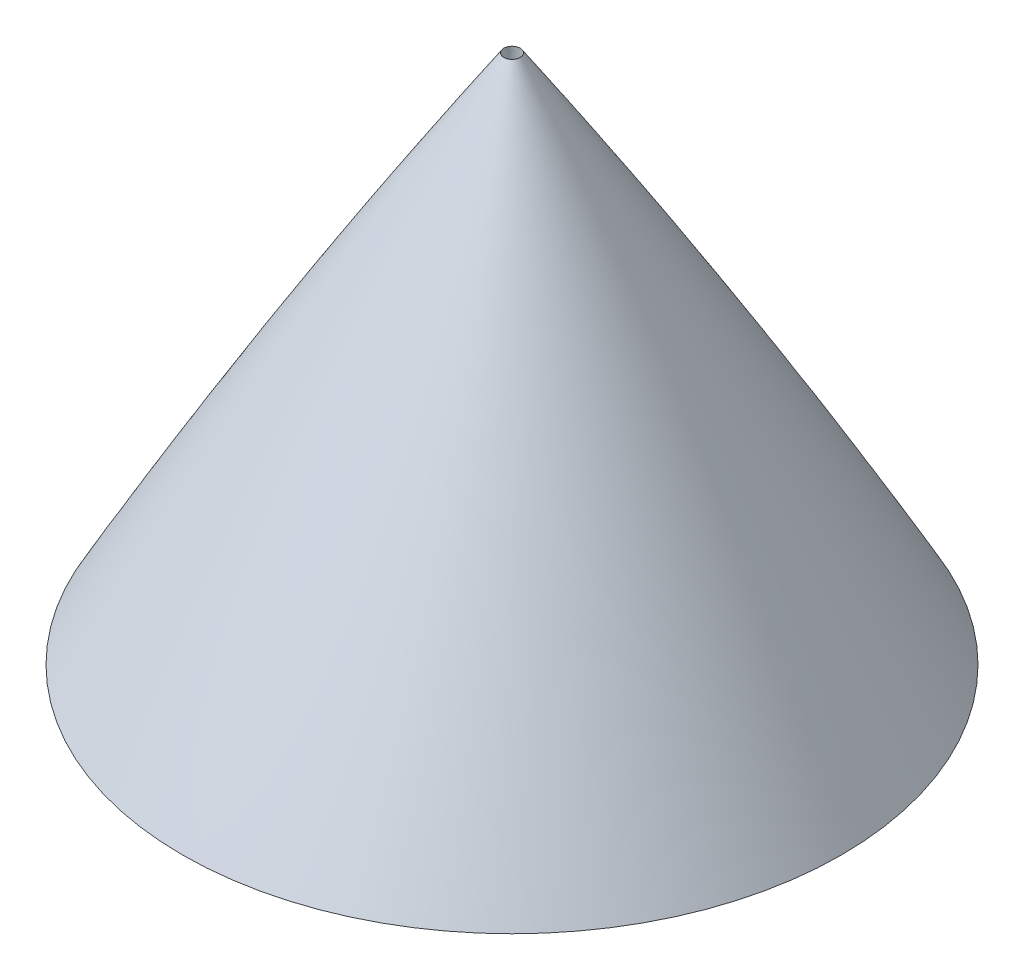
ISO-10303-21;
HEADER;
FILE_DESCRIPTION(('STEP AP214'),'2;1');
FILE_NAME('part.step','',(''),(''),'','','');
FILE_SCHEMA(('AUTOMOTIVE_DESIGN { 1 0 10303 214 1 1 1 1 }'));
ENDSEC;
DATA;
#1=APPLICATION_CONTEXT('core data for automotive mechanical design processes');
#2=APPLICATION_PROTOCOL_DEFINITION('international standard','automotive_design',2000,#1);
#3=PRODUCT_CONTEXT('',#1,'mechanical');
#4=PRODUCT('Part','Part','',(#3));
#5=PRODUCT_RELATED_PRODUCT_CATEGORY('part','',(#4));
#6=PRODUCT_DEFINITION_FORMATION('','',#4);
#7=PRODUCT_DEFINITION_CONTEXT('part definition',#1,'design');
#8=PRODUCT_DEFINITION('design','',#6,#7);
#9=PRODUCT_DEFINITION_SHAPE('','',#8);
#10=(LENGTH_UNIT() NAMED_UNIT(*) SI_UNIT(.MILLI.,.METRE.));
#11=(NAMED_UNIT(*) PLANE_ANGLE_UNIT() SI_UNIT($,.RADIAN.));
#12=(NAMED_UNIT(*) SI_UNIT($,.STERADIAN.) SOLID_ANGLE_UNIT());
#13=UNCERTAINTY_MEASURE_WITH_UNIT(LENGTH_MEASURE(1.E-05),#10,'distance_accuracy_value','');
#14=(GEOMETRIC_REPRESENTATION_CONTEXT(3) GLOBAL_UNCERTAINTY_ASSIGNED_CONTEXT((#13)) GLOBAL_UNIT_ASSIGNED_CONTEXT((#10,
#11,#12)) REPRESENTATION_CONTEXT('',''));
#15=CARTESIAN_POINT('',(0.,0.,0.));
#16=DIRECTION('',(0.,0.,1.));
#17=DIRECTION('',(1.,0.,0.));
#18=AXIS2_PLACEMENT_3D('',#15,#16,#17);
#19=CARTESIAN_POINT('',(-7.88479995199602,394.487869064574,0.));
#20=CARTESIAN_POINT('',(-7.72140536676829,394.240540683494,0.));
#21=CARTESIAN_POINT('',(-7.42070628814782,393.783996042711,0.));
#22=CARTESIAN_POINT('',(-6.81889000688673,392.866697934829,0.));
#23=CARTESIAN_POINT('',(-6.2109489301506,391.935964105814,0.));
#24=CARTESIAN_POINT('',(-5.65600271289266,391.081349613005,0.));
#25=CARTESIAN_POINT('',(-5.11513446695923,390.243806630814,0.));
#26=CARTESIAN_POINT('',(-4.38988600416232,389.11524640624,0.));
#27=CARTESIAN_POINT('',(-3.11283410738657,387.113712956491,0.));
#28=CARTESIAN_POINT('',(-1.31985258461331,384.260042493793,0.));
#29=CARTESIAN_POINT('',(2.93079998061805,377.356569284525,0.));
#30=CARTESIAN_POINT('',(11.7925044557124,362.199887034027,0.));
#31=CARTESIAN_POINT('',(29.0792173452243,328.534275171927,0.));
#32=CARTESIAN_POINT('',(48.4085880406204,277.933780444389,0.));
#33=CARTESIAN_POINT('',(60.1724971060447,225.059949931922,0.));
#34=CARTESIAN_POINT('',(64.3060048900808,187.441870001659,0.));
#35=CARTESIAN_POINT('',(65.2666741314204,169.911010474738,0.));
#36=CARTESIAN_POINT('',(65.5253655271583,161.807957388074,0.));
#37=CARTESIAN_POINT('',(65.6023455713222,158.438692592077,0.));
#38=CARTESIAN_POINT('',(65.6400907127438,156.064661932082,0.));
#39=CARTESIAN_POINT('',(65.6570461409592,154.723430387148,0.));
#40=CARTESIAN_POINT('',(65.6674292329821,153.72640112475,0.));
#41=CARTESIAN_POINT('',(65.6754767654316,152.707134592346,0.));
#42=CARTESIAN_POINT('',(65.6812650395233,151.595575292596,0.));
#43=CARTESIAN_POINT('',(65.6847575562007,150.498770837164,0.));
#44=CARTESIAN_POINT('',(65.6855183143814,149.951992082553,0.));
#45=CARTESIAN_POINT('',(65.6855183143814,149.6555493048,0.));
#46=B_SPLINE_CURVE_WITH_KNOTS('',3,(#19,#20,#21,#22,#23,#24,#25,#26,#27,#28,#29,#30,#31,#32,#33,
#34,#35,#36,#37,#38,#39,#40,#41,#42,#43,#44,#45),.UNSPECIFIED.,.F.,.F.,(4,1,1,1,1,1,1,1,1,1,1,1,
1,1,1,1,1,1,1,1,1,1,1,1,4),(0.0826164282316582,0.085875877662812,0.0891353270939658,
0.0923947765251196,0.0956542259562734,0.0989136753874272,0.102173124818581,0.108692023680889,
0.121729821405504,0.134767619130119,0.18691881002858,0.291221191825501,0.499825955419344,
0.708430719013187,0.812733100810108,0.864884291708569,0.877922089433184,0.8909598871578,
0.897478786020107,0.900738235451261,0.903997684882415,0.907257134313568,0.910516583744722,
0.913776033175876,0.91703548260703),.UNSPECIFIED.);
#47=CARTESIAN_POINT('',(0.,-198.817850362013,0.));
#48=DIRECTION('',(0.,-1.,0.));
#49=AXIS1_PLACEMENT('',#47,#48);
#50=SURFACE_OF_REVOLUTION('',#46,#49);
#51=CARTESIAN_POINT('',(0.,381.399184658156,0.));
#52=DIRECTION('',(0.,-1.,0.));
#53=DIRECTION('',(0.,0.,-1.));
#54=AXIS2_PLACEMENT_3D('',#51,#52,#53);
#55=CIRCLE('',#54,0.437502497427448);
#56=CARTESIAN_POINT('',(0.,381.399184658156,-0.437502497427448));
#57=VERTEX_POINT('',#56);
#58=EDGE_CURVE('E10',#57,#57,#55,.T.);
#59=ORIENTED_EDGE('',*,*,#58,.F.);
#60=EDGE_LOOP('',(#59));
#61=FACE_BOUND('',#60,.T.);
#62=CARTESIAN_POINT('',(0.,370.000000000036,0.));
#63=DIRECTION('',(0.,-1.,0.));
#64=DIRECTION('',(0.,0.,-1.));
#65=AXIS2_PLACEMENT_3D('',#62,#63,#64);
#66=CIRCLE('',#65,7.17771880344443);
#67=CARTESIAN_POINT('',(0.,370.000000000036,-7.17771880344443));
#68=VERTEX_POINT('',#67);
#69=EDGE_CURVE('E43',#68,#68,#66,.T.);
#70=ORIENTED_EDGE('',*,*,#69,.T.);
#71=EDGE_LOOP('',(#70));
#72=FACE_BOUND('',#71,.T.);
#73=ADVANCED_FACE('F31',(#61,#72),#50,.F.);
#74=CARTESIAN_POINT('',(0.45884508778124,400.000000000036,0.));
#75=CARTESIAN_POINT('',(0.666505615206481,399.685666804779,0.));
#76=CARTESIAN_POINT('',(1.08357762241834,399.052178662292,0.));
#77=CARTESIAN_POINT('',(1.97005947485793,397.700550841089,0.));
#78=CARTESIAN_POINT('',(2.93675965541901,396.211212549168,0.));
#79=CARTESIAN_POINT('',(3.90263482138941,394.710095548427,0.));
#80=CARTESIAN_POINT('',(4.88010073602912,393.178406868164,0.));
#81=CARTESIAN_POINT('',(5.84404798878273,391.654155139359,0.));
#82=CARTESIAN_POINT('',(6.80336026543289,390.123894265654,0.));
#83=CARTESIAN_POINT('',(7.76182166235367,388.581395306559,0.));
#84=CARTESIAN_POINT('',(8.71923772748013,387.026713905721,0.));
#85=CARTESIAN_POINT('',(16.6465602896951,374.037008418675,0.));
#86=CARTESIAN_POINT('',(28.2573009220358,353.014913090752,0.));
#87=CARTESIAN_POINT('',(42.1020234330347,323.258697721535,0.));
#88=CARTESIAN_POINT('',(56.6107679758156,282.331206246543,0.));
#89=CARTESIAN_POINT('',(67.059558570033,242.080254250225,0.));
#90=CARTESIAN_POINT('',(72.3340528648361,209.220016815667,0.));
#91=CARTESIAN_POINT('',(74.5835290996742,183.923611768303,0.));
#92=CARTESIAN_POINT('',(75.2730534127639,169.173424135973,0.));
#93=CARTESIAN_POINT('',(75.3972715831291,165.955632221619,0.));
#94=CARTESIAN_POINT('',(75.4847783790586,163.208321648792,0.));
#95=CARTESIAN_POINT('',(75.5353178217127,161.39300041231,0.));
#96=CARTESIAN_POINT('',(75.578401527883,159.587415565541,0.));
#97=CARTESIAN_POINT('',(75.6143056571779,157.784317211241,0.));
#98=CARTESIAN_POINT('',(75.6430296418871,155.967426666512,0.));
#99=CARTESIAN_POINT('',(75.6645730278296,154.182939709637,0.));
#100=CARTESIAN_POINT('',(75.6789354743668,152.406482910156,0.));
#101=CARTESIAN_POINT('',(75.6843214343995,150.790982344557,0.));
#102=CARTESIAN_POINT('',(75.6855183143858,150.032282913975,0.));
#103=CARTESIAN_POINT('',(75.6855183143858,149.655549304802,0.));
#104=B_SPLINE_CURVE_WITH_KNOTS('',4,(#74,#75,#76,#77,#78,#79,#80,#81,#82,#83,#84,#85,#86,#87,
#88,#89,#90,#91,#92,#93,#94,#95,#96,#97,#98,#99,#100,#101,#102,#103),.UNSPECIFIED.,.F.,.F.,(5,1,
1,1,1,1,1,1,1,1,1,1,1,1,1,1,1,1,1,1,1,1,1,1,1,1,5),(0.0826164282316582,0.088299706346032,
0.0939829844604058,0.0996662625747796,0.105349540689153,0.111032818803527,0.116716096917901,
0.122399375032275,0.128082653146649,0.133891141901002,0.139699630655356,0.313954310904782,
0.430124091568336,0.546293874226719,0.68569761210705,0.836718331478718,0.84833530900807,
0.865760775302099,0.871569264066775,0.877252541384307,0.882935818701838,0.88861909601937,
0.894302373336902,0.899985650654434,0.905668927971966,0.911352205289498,0.91703548260703),.UNSPECIFIED.);
#105=CARTESIAN_POINT('',(0.,-198.817850362013,0.));
#106=DIRECTION('',(0.,-1.,0.));
#107=AXIS1_PLACEMENT('',#105,#106);
#108=SURFACE_OF_REVOLUTION('',#104,#107);
#109=CARTESIAN_POINT('',(0.,400.000000000036,0.));
#110=DIRECTION('',(0.,-1.,0.));
#111=DIRECTION('',(0.,0.,-1.));
#112=AXIS2_PLACEMENT_3D('',#109,#110,#111);
#113=CIRCLE('',#112,0.45884508778124);
#114=CARTESIAN_POINT('',(0.,400.000000000036,-0.45884508778124));
#115=VERTEX_POINT('',#114);
#116=EDGE_CURVE('E39',#115,#115,#113,.T.);
#117=ORIENTED_EDGE('',*,*,#116,.T.);
#118=EDGE_LOOP('',(#117));
#119=FACE_BOUND('',#118,.T.);
#120=CARTESIAN_POINT('',(0.,370.000000000036,0.));
#121=DIRECTION('',(0.,-1.,0.));
#122=DIRECTION('',(0.,0.,-1.));
#123=AXIS2_PLACEMENT_3D('',#120,#121,#122);
#124=CIRCLE('',#123,18.6536702211835);
#125=CARTESIAN_POINT('',(0.,370.000000000036,-18.6536702211835));
#126=VERTEX_POINT('',#125);
#127=EDGE_CURVE('E35',#126,#126,#124,.T.);
#128=ORIENTED_EDGE('',*,*,#127,.F.);
#129=EDGE_LOOP('',(#128));
#130=FACE_BOUND('',#129,.T.);
#131=ADVANCED_FACE('F58',(#119,#130),#108,.T.);
#132=CARTESIAN_POINT('',(0.,400.000000000036,0.));
#133=DIRECTION('',(0.,1.,0.));
#134=DIRECTION('',(0.,0.,1.));
#135=AXIS2_PLACEMENT_3D('',#132,#133,#134);
#136=CONICAL_SURFACE('',#135,0.45884508778124,0.0011474002937765);
#137=ORIENTED_EDGE('',*,*,#58,.T.);
#138=EDGE_LOOP('',(#137));
#139=FACE_BOUND('',#138,.T.);
#140=ORIENTED_EDGE('',*,*,#116,.F.);
#141=EDGE_LOOP('',(#140));
#142=FACE_BOUND('',#141,.T.);
#143=ADVANCED_FACE('F33',(#139,#142),#136,.F.);
#144=CARTESIAN_POINT('',(0.,370.000000000036,0.));
#145=DIRECTION('',(0.,-1.,0.));
#146=DIRECTION('',(1.,0.,0.));
#147=AXIS2_PLACEMENT_3D('',#144,#145,#146);
#148=PLANE('',#147);
#149=ORIENTED_EDGE('',*,*,#69,.F.);
#150=EDGE_LOOP('',(#149));
#151=FACE_BOUND('',#150,.T.);
#152=ORIENTED_EDGE('',*,*,#127,.T.);
#153=EDGE_LOOP('',(#152));
#154=FACE_BOUND('',#153,.T.);
#155=ADVANCED_FACE('F62',(#151,#154),#148,.T.);
#156=CLOSED_SHELL('',(#73,#131,#143,#155));
#157=MANIFOLD_SOLID_BREP('B2',#156);
#158=ADVANCED_BREP_SHAPE_REPRESENTATION('',(#18,#157),#14);
#159=SHAPE_DEFINITION_REPRESENTATION(#9,#158);
ENDSEC;
END-ISO-10303-21;
